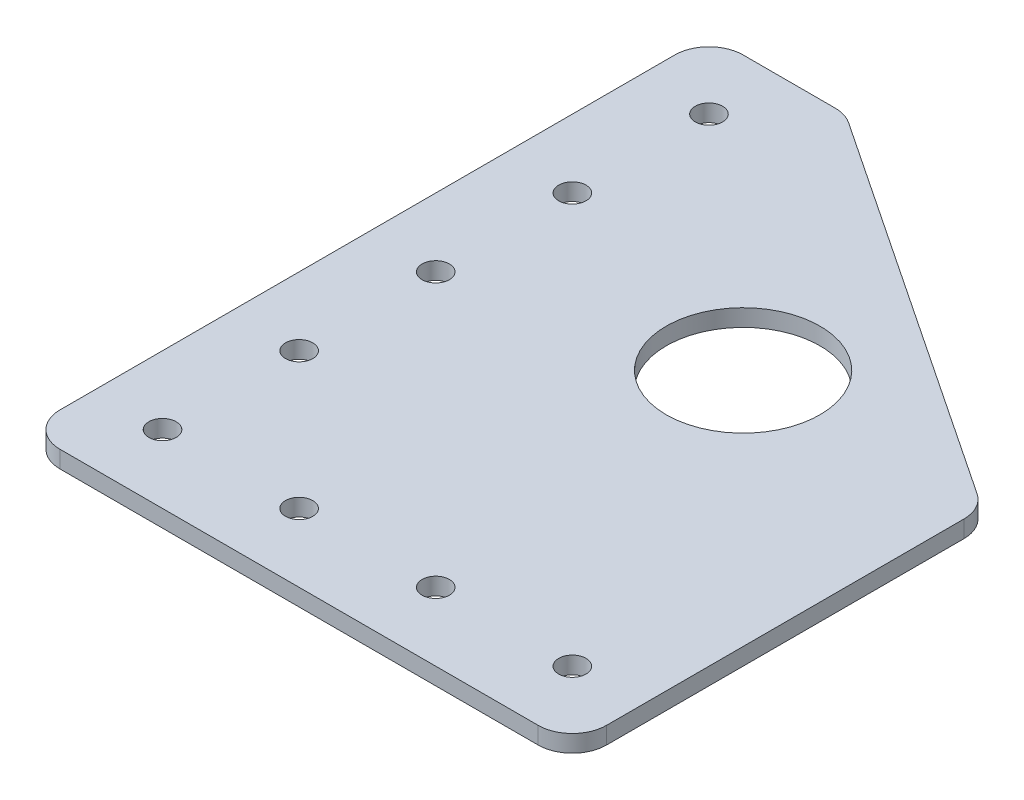
ISO-10303-21;
HEADER;
FILE_DESCRIPTION(('STEP AP214'),'2;1');
FILE_NAME('part.step','',(''),(''),'','','');
FILE_SCHEMA(('AUTOMOTIVE_DESIGN { 1 0 10303 214 1 1 1 1 }'));
ENDSEC;
DATA;
#1=APPLICATION_CONTEXT('core data for automotive mechanical design processes');
#2=APPLICATION_PROTOCOL_DEFINITION('international standard','automotive_design',2000,#1);
#3=PRODUCT_CONTEXT('',#1,'mechanical');
#4=PRODUCT('Part','Part','',(#3));
#5=PRODUCT_RELATED_PRODUCT_CATEGORY('part','',(#4));
#6=PRODUCT_DEFINITION_FORMATION('','',#4);
#7=PRODUCT_DEFINITION_CONTEXT('part definition',#1,'design');
#8=PRODUCT_DEFINITION('design','',#6,#7);
#9=PRODUCT_DEFINITION_SHAPE('','',#8);
#10=(LENGTH_UNIT() NAMED_UNIT(*) SI_UNIT(.MILLI.,.METRE.));
#11=(NAMED_UNIT(*) PLANE_ANGLE_UNIT() SI_UNIT($,.RADIAN.));
#12=(NAMED_UNIT(*) SI_UNIT($,.STERADIAN.) SOLID_ANGLE_UNIT());
#13=UNCERTAINTY_MEASURE_WITH_UNIT(LENGTH_MEASURE(1.E-05),#10,'distance_accuracy_value','');
#14=(GEOMETRIC_REPRESENTATION_CONTEXT(3) GLOBAL_UNCERTAINTY_ASSIGNED_CONTEXT((#13)) GLOBAL_UNIT_ASSIGNED_CONTEXT((#10,
#11,#12)) REPRESENTATION_CONTEXT('',''));
#15=CARTESIAN_POINT('',(0.,0.,0.));
#16=DIRECTION('',(0.,0.,1.));
#17=DIRECTION('',(1.,0.,0.));
#18=AXIS2_PLACEMENT_3D('',#15,#16,#17);
#19=CARTESIAN_POINT('',(95.25,3.175,-72.8015831336012));
#20=DIRECTION('',(0.,-1.,0.));
#21=DIRECTION('',(0.,0.,-1.));
#22=AXIS2_PLACEMENT_3D('',#19,#20,#21);
#23=PLANE('',#22);
#24=CARTESIAN_POINT('',(95.25,3.175,-72.8015831336012));
#25=DIRECTION('',(0.,1.,0.));
#26=DIRECTION('',(0.,0.,-1.));
#27=AXIS2_PLACEMENT_3D('',#24,#25,#26);
#28=CIRCLE('',#27,6.35);
#29=CARTESIAN_POINT('',(101.6,3.175,-72.8015831336012));
#30=VERTEX_POINT('',#29);
#31=CARTESIAN_POINT('',(98.7723462460302,3.175,-78.0851025026465));
#32=VERTEX_POINT('',#31);
#33=EDGE_CURVE('E182',#30,#32,#28,.T.);
#34=ORIENTED_EDGE('',*,*,#33,.T.);
#35=DIRECTION('',(-0.832050294337844,0.,-0.554700196225229));
#36=VECTOR('',#35,1.);
#37=CARTESIAN_POINT('',(26.9997209464321,3.175,-125.933519369045));
#38=LINE('',#37,#36);
#39=CARTESIAN_POINT('',(26.9997209464321,3.175,-125.933519369045));
#40=VERTEX_POINT('',#39);
#41=EDGE_CURVE('E106',#32,#40,#38,.T.);
#42=ORIENTED_EDGE('',*,*,#41,.T.);
#43=CARTESIAN_POINT('',(23.4773747004018,3.175,-120.65));
#44=DIRECTION('',(0.,1.,0.));
#45=DIRECTION('',(0.,0.,-1.));
#46=AXIS2_PLACEMENT_3D('',#43,#44,#45);
#47=CIRCLE('',#46,6.34999999999999);
#48=CARTESIAN_POINT('',(23.4773747004018,3.175,-127.));
#49=VERTEX_POINT('',#48);
#50=EDGE_CURVE('E211',#40,#49,#47,.T.);
#51=ORIENTED_EDGE('',*,*,#50,.T.);
#52=DIRECTION('',(-1.,0.,0.));
#53=VECTOR('',#52,1.);
#54=CARTESIAN_POINT('',(6.35000000000004,3.175,-127.));
#55=LINE('',#54,#53);
#56=CARTESIAN_POINT('',(6.35000000000004,3.175,-127.));
#57=VERTEX_POINT('',#56);
#58=EDGE_CURVE('E231',#49,#57,#55,.T.);
#59=ORIENTED_EDGE('',*,*,#58,.T.);
#60=CARTESIAN_POINT('',(6.35,3.175,-120.65));
#61=DIRECTION('',(0.,1.,0.));
#62=DIRECTION('',(0.,0.,-1.));
#63=AXIS2_PLACEMENT_3D('',#60,#61,#62);
#64=CIRCLE('',#63,6.35);
#65=CARTESIAN_POINT('',(0.,3.175,-120.65));
#66=VERTEX_POINT('',#65);
#67=EDGE_CURVE('E227',#57,#66,#64,.T.);
#68=ORIENTED_EDGE('',*,*,#67,.T.);
#69=DIRECTION('',(0.,0.,1.));
#70=VECTOR('',#69,1.);
#71=CARTESIAN_POINT('',(0.,3.175,-6.35000000000004));
#72=LINE('',#71,#70);
#73=CARTESIAN_POINT('',(0.,3.175,-6.35000000000004));
#74=VERTEX_POINT('',#73);
#75=EDGE_CURVE('E230',#66,#74,#72,.T.);
#76=ORIENTED_EDGE('',*,*,#75,.T.);
#77=CARTESIAN_POINT('',(6.35,3.175,-6.35));
#78=DIRECTION('',(0.,1.,0.));
#79=DIRECTION('',(0.,0.,1.));
#80=AXIS2_PLACEMENT_3D('',#77,#78,#79);
#81=CIRCLE('',#80,6.35);
#82=CARTESIAN_POINT('',(6.35,3.175,0.));
#83=VERTEX_POINT('',#82);
#84=EDGE_CURVE('E131',#74,#83,#81,.T.);
#85=ORIENTED_EDGE('',*,*,#84,.T.);
#86=DIRECTION('',(1.,0.,0.));
#87=VECTOR('',#86,1.);
#88=CARTESIAN_POINT('',(95.2499999999999,3.175,0.));
#89=LINE('',#88,#87);
#90=CARTESIAN_POINT('',(95.2499999999999,3.175,0.));
#91=VERTEX_POINT('',#90);
#92=EDGE_CURVE('E125',#83,#91,#89,.T.);
#93=ORIENTED_EDGE('',*,*,#92,.T.);
#94=CARTESIAN_POINT('',(95.25,3.175,-6.34999999999999));
#95=DIRECTION('',(0.,1.,0.));
#96=DIRECTION('',(0.,0.,-1.));
#97=AXIS2_PLACEMENT_3D('',#94,#95,#96);
#98=CIRCLE('',#97,6.35);
#99=CARTESIAN_POINT('',(101.6,3.175,-6.35000000000004));
#100=VERTEX_POINT('',#99);
#101=EDGE_CURVE('E129',#91,#100,#98,.T.);
#102=ORIENTED_EDGE('',*,*,#101,.T.);
#103=DIRECTION('',(0.,0.,-1.));
#104=VECTOR('',#103,1.);
#105=CARTESIAN_POINT('',(101.6,3.175,-72.8015831336012));
#106=LINE('',#105,#104);
#107=EDGE_CURVE('E57',#100,#30,#106,.T.);
#108=ORIENTED_EDGE('',*,*,#107,.T.);
#109=EDGE_LOOP('',(#34,#42,#51,#59,#68,#76,#85,#93,#102,#108));
#110=FACE_BOUND('',#109,.T.);
#111=CARTESIAN_POINT('',(88.9,3.175,-12.7));
#112=DIRECTION('',(0.,1.,0.));
#113=DIRECTION('',(0.,0.,1.));
#114=AXIS2_PLACEMENT_3D('',#111,#112,#113);
#115=CIRCLE('',#114,2.54);
#116=CARTESIAN_POINT('',(88.9,3.175,-10.16));
#117=VERTEX_POINT('',#116);
#118=EDGE_CURVE('E158',#117,#117,#115,.T.);
#119=ORIENTED_EDGE('',*,*,#118,.F.);
#120=EDGE_LOOP('',(#119));
#121=FACE_BOUND('',#120,.T.);
#122=CARTESIAN_POINT('',(63.5,3.175,-12.6999999999998));
#123=DIRECTION('',(0.,1.,0.));
#124=DIRECTION('',(0.,0.,1.));
#125=AXIS2_PLACEMENT_3D('',#122,#123,#124);
#126=CIRCLE('',#125,2.54000000000001);
#127=CARTESIAN_POINT('',(63.5,3.175,-10.1599999999998));
#128=VERTEX_POINT('',#127);
#129=EDGE_CURVE('E249',#128,#128,#126,.T.);
#130=ORIENTED_EDGE('',*,*,#129,.F.);
#131=EDGE_LOOP('',(#130));
#132=FACE_BOUND('',#131,.T.);
#133=CARTESIAN_POINT('',(38.1,3.175,-12.6999999999996));
#134=DIRECTION('',(0.,1.,0.));
#135=DIRECTION('',(0.,0.,1.));
#136=AXIS2_PLACEMENT_3D('',#133,#134,#135);
#137=CIRCLE('',#136,2.54);
#138=CARTESIAN_POINT('',(38.1,3.175,-10.1599999999996));
#139=VERTEX_POINT('',#138);
#140=EDGE_CURVE('E257',#139,#139,#137,.T.);
#141=ORIENTED_EDGE('',*,*,#140,.F.);
#142=EDGE_LOOP('',(#141));
#143=FACE_BOUND('',#142,.T.);
#144=CARTESIAN_POINT('',(12.7,3.175,-12.6999999999995));
#145=DIRECTION('',(0.,1.,0.));
#146=DIRECTION('',(0.,0.,1.));
#147=AXIS2_PLACEMENT_3D('',#144,#145,#146);
#148=CIRCLE('',#147,2.54);
#149=CARTESIAN_POINT('',(12.7,3.175,-10.1599999999995));
#150=VERTEX_POINT('',#149);
#151=EDGE_CURVE('E265',#150,#150,#148,.T.);
#152=ORIENTED_EDGE('',*,*,#151,.F.);
#153=EDGE_LOOP('',(#152));
#154=FACE_BOUND('',#153,.T.);
#155=CARTESIAN_POINT('',(12.6999999999999,3.175,-38.0999999999995));
#156=DIRECTION('',(0.,1.,0.));
#157=DIRECTION('',(0.,0.,1.));
#158=AXIS2_PLACEMENT_3D('',#155,#156,#157);
#159=CIRCLE('',#158,2.53999999999999);
#160=CARTESIAN_POINT('',(12.6999999999999,3.175,-35.5599999999995));
#161=VERTEX_POINT('',#160);
#162=EDGE_CURVE('E273',#161,#161,#159,.T.);
#163=ORIENTED_EDGE('',*,*,#162,.F.);
#164=EDGE_LOOP('',(#163));
#165=FACE_BOUND('',#164,.T.);
#166=CARTESIAN_POINT('',(12.6999999999998,3.175,-63.4999999999995));
#167=DIRECTION('',(0.,1.,0.));
#168=DIRECTION('',(0.,0.,1.));
#169=AXIS2_PLACEMENT_3D('',#166,#167,#168);
#170=CIRCLE('',#169,2.54);
#171=CARTESIAN_POINT('',(12.6999999999998,3.175,-60.9599999999995));
#172=VERTEX_POINT('',#171);
#173=EDGE_CURVE('E281',#172,#172,#170,.T.);
#174=ORIENTED_EDGE('',*,*,#173,.F.);
#175=EDGE_LOOP('',(#174));
#176=FACE_BOUND('',#175,.T.);
#177=CARTESIAN_POINT('',(12.6999999999997,3.175,-88.8999999999995));
#178=DIRECTION('',(0.,1.,0.));
#179=DIRECTION('',(0.,0.,1.));
#180=AXIS2_PLACEMENT_3D('',#177,#178,#179);
#181=CIRCLE('',#180,2.54);
#182=CARTESIAN_POINT('',(12.6999999999997,3.175,-86.3599999999994));
#183=VERTEX_POINT('',#182);
#184=EDGE_CURVE('E289',#183,#183,#181,.T.);
#185=ORIENTED_EDGE('',*,*,#184,.F.);
#186=EDGE_LOOP('',(#185));
#187=FACE_BOUND('',#186,.T.);
#188=CARTESIAN_POINT('',(12.6999999999996,3.175,-114.299999999999));
#189=DIRECTION('',(0.,1.,0.));
#190=DIRECTION('',(0.,0.,1.));
#191=AXIS2_PLACEMENT_3D('',#188,#189,#190);
#192=CIRCLE('',#191,2.54);
#193=CARTESIAN_POINT('',(12.6999999999996,3.175,-111.759999999999));
#194=VERTEX_POINT('',#193);
#195=EDGE_CURVE('E297',#194,#194,#192,.T.);
#196=ORIENTED_EDGE('',*,*,#195,.F.);
#197=EDGE_LOOP('',(#196));
#198=FACE_BOUND('',#197,.T.);
#199=CARTESIAN_POINT('',(57.15,3.175,-76.2));
#200=DIRECTION('',(0.,1.,0.));
#201=DIRECTION('',(0.,0.,1.));
#202=AXIS2_PLACEMENT_3D('',#199,#200,#201);
#203=CIRCLE('',#202,14.2875);
#204=CARTESIAN_POINT('',(57.15,3.175,-61.9125));
#205=VERTEX_POINT('',#204);
#206=EDGE_CURVE('E305',#205,#205,#203,.T.);
#207=ORIENTED_EDGE('',*,*,#206,.F.);
#208=EDGE_LOOP('',(#207));
#209=FACE_BOUND('',#208,.T.);
#210=ADVANCED_FACE('F39',(#110,#121,#132,#143,#154,#165,#176,#187,#198,#209),#23,.F.);
#211=CARTESIAN_POINT('',(95.25,0.,-72.8015831336012));
#212=DIRECTION('',(0.,-1.,0.));
#213=DIRECTION('',(0.,0.,-1.));
#214=AXIS2_PLACEMENT_3D('',#211,#212,#213);
#215=PLANE('',#214);
#216=CARTESIAN_POINT('',(12.6999999999996,0.,-114.299999999999));
#217=DIRECTION('',(0.,1.,0.));
#218=DIRECTION('',(0.,0.,1.));
#219=AXIS2_PLACEMENT_3D('',#216,#217,#218);
#220=CIRCLE('',#219,2.54);
#221=CARTESIAN_POINT('',(12.6999999999996,0.,-111.759999999999));
#222=VERTEX_POINT('',#221);
#223=EDGE_CURVE('E301',#222,#222,#220,.T.);
#224=ORIENTED_EDGE('',*,*,#223,.T.);
#225=EDGE_LOOP('',(#224));
#226=FACE_BOUND('',#225,.T.);
#227=CARTESIAN_POINT('',(12.6999999999998,0.,-63.4999999999995));
#228=DIRECTION('',(0.,1.,0.));
#229=DIRECTION('',(0.,0.,1.));
#230=AXIS2_PLACEMENT_3D('',#227,#228,#229);
#231=CIRCLE('',#230,2.54);
#232=CARTESIAN_POINT('',(12.6999999999998,0.,-60.9599999999995));
#233=VERTEX_POINT('',#232);
#234=EDGE_CURVE('E285',#233,#233,#231,.T.);
#235=ORIENTED_EDGE('',*,*,#234,.T.);
#236=EDGE_LOOP('',(#235));
#237=FACE_BOUND('',#236,.T.);
#238=CARTESIAN_POINT('',(12.7,0.,-12.6999999999995));
#239=DIRECTION('',(0.,1.,0.));
#240=DIRECTION('',(0.,0.,1.));
#241=AXIS2_PLACEMENT_3D('',#238,#239,#240);
#242=CIRCLE('',#241,2.54);
#243=CARTESIAN_POINT('',(12.7,0.,-10.1599999999995));
#244=VERTEX_POINT('',#243);
#245=EDGE_CURVE('E269',#244,#244,#242,.T.);
#246=ORIENTED_EDGE('',*,*,#245,.T.);
#247=EDGE_LOOP('',(#246));
#248=FACE_BOUND('',#247,.T.);
#249=CARTESIAN_POINT('',(63.5,0.,-12.6999999999998));
#250=DIRECTION('',(0.,1.,0.));
#251=DIRECTION('',(0.,0.,1.));
#252=AXIS2_PLACEMENT_3D('',#249,#250,#251);
#253=CIRCLE('',#252,2.54000000000001);
#254=CARTESIAN_POINT('',(63.5,0.,-10.1599999999998));
#255=VERTEX_POINT('',#254);
#256=EDGE_CURVE('E253',#255,#255,#253,.T.);
#257=ORIENTED_EDGE('',*,*,#256,.T.);
#258=EDGE_LOOP('',(#257));
#259=FACE_BOUND('',#258,.T.);
#260=CARTESIAN_POINT('',(95.25,0.,-72.8015831336012));
#261=DIRECTION('',(0.,1.,0.));
#262=DIRECTION('',(0.,0.,-1.));
#263=AXIS2_PLACEMENT_3D('',#260,#261,#262);
#264=CIRCLE('',#263,6.35);
#265=CARTESIAN_POINT('',(101.6,0.,-72.8015831336012));
#266=VERTEX_POINT('',#265);
#267=CARTESIAN_POINT('',(98.7723462460302,0.,-78.0851025026465));
#268=VERTEX_POINT('',#267);
#269=EDGE_CURVE('E153',#266,#268,#264,.T.);
#270=ORIENTED_EDGE('',*,*,#269,.F.);
#271=DIRECTION('',(0.,0.,-1.));
#272=VECTOR('',#271,1.);
#273=CARTESIAN_POINT('',(101.6,0.,-72.8015831336012));
#274=LINE('',#273,#272);
#275=CARTESIAN_POINT('',(101.6,0.,-6.35000000000004));
#276=VERTEX_POINT('',#275);
#277=EDGE_CURVE('E98',#276,#266,#274,.T.);
#278=ORIENTED_EDGE('',*,*,#277,.F.);
#279=CARTESIAN_POINT('',(95.25,0.,-6.34999999999999));
#280=DIRECTION('',(0.,1.,0.));
#281=DIRECTION('',(0.,0.,-1.));
#282=AXIS2_PLACEMENT_3D('',#279,#280,#281);
#283=CIRCLE('',#282,6.35);
#284=CARTESIAN_POINT('',(95.2499999999999,0.,0.));
#285=VERTEX_POINT('',#284);
#286=EDGE_CURVE('E92',#285,#276,#283,.T.);
#287=ORIENTED_EDGE('',*,*,#286,.F.);
#288=DIRECTION('',(1.,0.,0.));
#289=VECTOR('',#288,1.);
#290=CARTESIAN_POINT('',(95.2499999999999,0.,0.));
#291=LINE('',#290,#289);
#292=CARTESIAN_POINT('',(6.35,0.,0.));
#293=VERTEX_POINT('',#292);
#294=EDGE_CURVE('E140',#293,#285,#291,.T.);
#295=ORIENTED_EDGE('',*,*,#294,.F.);
#296=CARTESIAN_POINT('',(6.35,0.,-6.35));
#297=DIRECTION('',(0.,1.,0.));
#298=DIRECTION('',(0.,0.,1.));
#299=AXIS2_PLACEMENT_3D('',#296,#297,#298);
#300=CIRCLE('',#299,6.35);
#301=CARTESIAN_POINT('',(0.,0.,-6.35000000000004));
#302=VERTEX_POINT('',#301);
#303=EDGE_CURVE('E173',#302,#293,#300,.T.);
#304=ORIENTED_EDGE('',*,*,#303,.F.);
#305=DIRECTION('',(0.,0.,1.));
#306=VECTOR('',#305,1.);
#307=CARTESIAN_POINT('',(0.,0.,-6.35000000000004));
#308=LINE('',#307,#306);
#309=CARTESIAN_POINT('',(0.,0.,-120.65));
#310=VERTEX_POINT('',#309);
#311=EDGE_CURVE('E170',#310,#302,#308,.T.);
#312=ORIENTED_EDGE('',*,*,#311,.F.);
#313=CARTESIAN_POINT('',(6.35,0.,-120.65));
#314=DIRECTION('',(0.,1.,0.));
#315=DIRECTION('',(0.,0.,-1.));
#316=AXIS2_PLACEMENT_3D('',#313,#314,#315);
#317=CIRCLE('',#316,6.35);
#318=CARTESIAN_POINT('',(6.35000000000004,0.,-127.));
#319=VERTEX_POINT('',#318);
#320=EDGE_CURVE('E167',#319,#310,#317,.T.);
#321=ORIENTED_EDGE('',*,*,#320,.F.);
#322=DIRECTION('',(-1.,0.,0.));
#323=VECTOR('',#322,1.);
#324=CARTESIAN_POINT('',(6.35000000000004,0.,-127.));
#325=LINE('',#324,#323);
#326=CARTESIAN_POINT('',(23.4773747004018,0.,-127.));
#327=VERTEX_POINT('',#326);
#328=EDGE_CURVE('E164',#327,#319,#325,.T.);
#329=ORIENTED_EDGE('',*,*,#328,.F.);
#330=CARTESIAN_POINT('',(23.4773747004018,0.,-120.65));
#331=DIRECTION('',(0.,1.,0.));
#332=DIRECTION('',(0.,0.,-1.));
#333=AXIS2_PLACEMENT_3D('',#330,#331,#332);
#334=CIRCLE('',#333,6.34999999999999);
#335=CARTESIAN_POINT('',(26.9997209464321,0.,-125.933519369045));
#336=VERTEX_POINT('',#335);
#337=EDGE_CURVE('E161',#336,#327,#334,.T.);
#338=ORIENTED_EDGE('',*,*,#337,.F.);
#339=DIRECTION('',(-0.832050294337844,0.,-0.554700196225229));
#340=VECTOR('',#339,1.);
#341=CARTESIAN_POINT('',(26.9997209464321,0.,-125.933519369045));
#342=LINE('',#341,#340);
#343=EDGE_CURVE('E157',#268,#336,#342,.T.);
#344=ORIENTED_EDGE('',*,*,#343,.F.);
#345=EDGE_LOOP('',(#270,#278,#287,#295,#304,#312,#321,#329,#338,#344));
#346=FACE_BOUND('',#345,.T.);
#347=CARTESIAN_POINT('',(88.9,0.,-12.7));
#348=DIRECTION('',(0.,1.,0.));
#349=DIRECTION('',(0.,0.,1.));
#350=AXIS2_PLACEMENT_3D('',#347,#348,#349);
#351=CIRCLE('',#350,2.54);
#352=CARTESIAN_POINT('',(88.9,0.,-10.16));
#353=VERTEX_POINT('',#352);
#354=EDGE_CURVE('E245',#353,#353,#351,.T.);
#355=ORIENTED_EDGE('',*,*,#354,.T.);
#356=EDGE_LOOP('',(#355));
#357=FACE_BOUND('',#356,.T.);
#358=CARTESIAN_POINT('',(38.1,0.,-12.6999999999996));
#359=DIRECTION('',(0.,1.,0.));
#360=DIRECTION('',(0.,0.,1.));
#361=AXIS2_PLACEMENT_3D('',#358,#359,#360);
#362=CIRCLE('',#361,2.54);
#363=CARTESIAN_POINT('',(38.1,0.,-10.1599999999996));
#364=VERTEX_POINT('',#363);
#365=EDGE_CURVE('E261',#364,#364,#362,.T.);
#366=ORIENTED_EDGE('',*,*,#365,.T.);
#367=EDGE_LOOP('',(#366));
#368=FACE_BOUND('',#367,.T.);
#369=CARTESIAN_POINT('',(12.6999999999999,0.,-38.0999999999995));
#370=DIRECTION('',(0.,1.,0.));
#371=DIRECTION('',(0.,0.,1.));
#372=AXIS2_PLACEMENT_3D('',#369,#370,#371);
#373=CIRCLE('',#372,2.53999999999999);
#374=CARTESIAN_POINT('',(12.6999999999999,0.,-35.5599999999995));
#375=VERTEX_POINT('',#374);
#376=EDGE_CURVE('E277',#375,#375,#373,.T.);
#377=ORIENTED_EDGE('',*,*,#376,.T.);
#378=EDGE_LOOP('',(#377));
#379=FACE_BOUND('',#378,.T.);
#380=CARTESIAN_POINT('',(12.6999999999997,0.,-88.8999999999995));
#381=DIRECTION('',(0.,1.,0.));
#382=DIRECTION('',(0.,0.,1.));
#383=AXIS2_PLACEMENT_3D('',#380,#381,#382);
#384=CIRCLE('',#383,2.54);
#385=CARTESIAN_POINT('',(12.6999999999997,0.,-86.3599999999994));
#386=VERTEX_POINT('',#385);
#387=EDGE_CURVE('E293',#386,#386,#384,.T.);
#388=ORIENTED_EDGE('',*,*,#387,.T.);
#389=EDGE_LOOP('',(#388));
#390=FACE_BOUND('',#389,.T.);
#391=CARTESIAN_POINT('',(57.15,0.,-76.2));
#392=DIRECTION('',(0.,1.,0.));
#393=DIRECTION('',(0.,0.,1.));
#394=AXIS2_PLACEMENT_3D('',#391,#392,#393);
#395=CIRCLE('',#394,14.2875);
#396=CARTESIAN_POINT('',(57.15,0.,-61.9125));
#397=VERTEX_POINT('',#396);
#398=EDGE_CURVE('E309',#397,#397,#395,.T.);
#399=ORIENTED_EDGE('',*,*,#398,.T.);
#400=EDGE_LOOP('',(#399));
#401=FACE_BOUND('',#400,.T.);
#402=ADVANCED_FACE('F215',(#226,#237,#248,#259,#346,#357,#368,#379,#390,#401),#215,.T.);
#403=CARTESIAN_POINT('',(95.25,3.175,-72.8015831336012));
#404=DIRECTION('',(0.,-1.,0.));
#405=DIRECTION('',(0.,0.,-1.));
#406=AXIS2_PLACEMENT_3D('',#403,#404,#405);
#407=CYLINDRICAL_SURFACE('',#406,6.35);
#408=ORIENTED_EDGE('',*,*,#269,.T.);
#409=DIRECTION('',(0.,-1.,0.));
#410=VECTOR('',#409,1.);
#411=CARTESIAN_POINT('',(98.7723462460302,3.175,-78.0851025026465));
#412=LINE('',#411,#410);
#413=EDGE_CURVE('E11',#32,#268,#412,.T.);
#414=ORIENTED_EDGE('',*,*,#413,.F.);
#415=ORIENTED_EDGE('',*,*,#33,.F.);
#416=DIRECTION('',(0.,-1.,0.));
#417=VECTOR('',#416,1.);
#418=CARTESIAN_POINT('',(101.6,3.175,-72.8015831336012));
#419=LINE('',#418,#417);
#420=EDGE_CURVE('E149',#30,#266,#419,.T.);
#421=ORIENTED_EDGE('',*,*,#420,.T.);
#422=EDGE_LOOP('',(#408,#414,#415,#421));
#423=FACE_BOUND('',#422,.T.);
#424=ADVANCED_FACE('F41',(#423),#407,.T.);
#425=CARTESIAN_POINT('',(26.9997209464321,3.175,-125.933519369045));
#426=DIRECTION('',(-0.554700196225229,0.,0.832050294337844));
#427=DIRECTION('',(0.832050294337844,0.,0.554700196225229));
#428=AXIS2_PLACEMENT_3D('',#425,#426,#427);
#429=PLANE('',#428);
#430=ORIENTED_EDGE('',*,*,#343,.T.);
#431=DIRECTION('',(0.,-1.,0.));
#432=VECTOR('',#431,1.);
#433=CARTESIAN_POINT('',(26.9997209464321,3.175,-125.933519369045));
#434=LINE('',#433,#432);
#435=EDGE_CURVE('E49',#40,#336,#434,.T.);
#436=ORIENTED_EDGE('',*,*,#435,.F.);
#437=ORIENTED_EDGE('',*,*,#41,.F.);
#438=ORIENTED_EDGE('',*,*,#413,.T.);
#439=EDGE_LOOP('',(#430,#436,#437,#438));
#440=FACE_BOUND('',#439,.T.);
#441=ADVANCED_FACE('F351',(#440),#429,.F.);
#442=CARTESIAN_POINT('',(23.4773747004018,3.175,-120.65));
#443=DIRECTION('',(0.,-1.,0.));
#444=DIRECTION('',(0.,0.,-1.));
#445=AXIS2_PLACEMENT_3D('',#442,#443,#444);
#446=CYLINDRICAL_SURFACE('',#445,6.34999999999999);
#447=ORIENTED_EDGE('',*,*,#337,.T.);
#448=DIRECTION('',(0.,-1.,0.));
#449=VECTOR('',#448,1.);
#450=CARTESIAN_POINT('',(23.4773747004018,3.175,-127.));
#451=LINE('',#450,#449);
#452=EDGE_CURVE('E201',#49,#327,#451,.T.);
#453=ORIENTED_EDGE('',*,*,#452,.F.);
#454=ORIENTED_EDGE('',*,*,#50,.F.);
#455=ORIENTED_EDGE('',*,*,#435,.T.);
#456=EDGE_LOOP('',(#447,#453,#454,#455));
#457=FACE_BOUND('',#456,.T.);
#458=ADVANCED_FACE('F209',(#457),#446,.T.);
#459=CARTESIAN_POINT('',(6.35000000000004,3.175,-127.));
#460=DIRECTION('',(0.,0.,1.));
#461=DIRECTION('',(1.,0.,0.));
#462=AXIS2_PLACEMENT_3D('',#459,#460,#461);
#463=PLANE('',#462);
#464=ORIENTED_EDGE('',*,*,#328,.T.);
#465=DIRECTION('',(0.,-1.,0.));
#466=VECTOR('',#465,1.);
#467=CARTESIAN_POINT('',(6.35000000000004,3.175,-127.));
#468=LINE('',#467,#466);
#469=EDGE_CURVE('E197',#57,#319,#468,.T.);
#470=ORIENTED_EDGE('',*,*,#469,.F.);
#471=ORIENTED_EDGE('',*,*,#58,.F.);
#472=ORIENTED_EDGE('',*,*,#452,.T.);
#473=EDGE_LOOP('',(#464,#470,#471,#472));
#474=FACE_BOUND('',#473,.T.);
#475=ADVANCED_FACE('F221',(#474),#463,.F.);
#476=CARTESIAN_POINT('',(6.35,3.175,-120.65));
#477=DIRECTION('',(0.,-1.,0.));
#478=DIRECTION('',(0.,0.,-1.));
#479=AXIS2_PLACEMENT_3D('',#476,#477,#478);
#480=CYLINDRICAL_SURFACE('',#479,6.35);
#481=ORIENTED_EDGE('',*,*,#320,.T.);
#482=DIRECTION('',(0.,-1.,0.));
#483=VECTOR('',#482,1.);
#484=CARTESIAN_POINT('',(0.,3.175,-120.65));
#485=LINE('',#484,#483);
#486=EDGE_CURVE('E193',#66,#310,#485,.T.);
#487=ORIENTED_EDGE('',*,*,#486,.F.);
#488=ORIENTED_EDGE('',*,*,#67,.F.);
#489=ORIENTED_EDGE('',*,*,#469,.T.);
#490=EDGE_LOOP('',(#481,#487,#488,#489));
#491=FACE_BOUND('',#490,.T.);
#492=ADVANCED_FACE('F225',(#491),#480,.T.);
#493=CARTESIAN_POINT('',(0.,3.175,-6.35000000000004));
#494=DIRECTION('',(1.,0.,0.));
#495=DIRECTION('',(0.,0.,-1.));
#496=AXIS2_PLACEMENT_3D('',#493,#494,#495);
#497=PLANE('',#496);
#498=ORIENTED_EDGE('',*,*,#311,.T.);
#499=DIRECTION('',(0.,-1.,0.));
#500=VECTOR('',#499,1.);
#501=CARTESIAN_POINT('',(0.,3.175,-6.35000000000004));
#502=LINE('',#501,#500);
#503=EDGE_CURVE('E189',#74,#302,#502,.T.);
#504=ORIENTED_EDGE('',*,*,#503,.F.);
#505=ORIENTED_EDGE('',*,*,#75,.F.);
#506=ORIENTED_EDGE('',*,*,#486,.T.);
#507=EDGE_LOOP('',(#498,#504,#505,#506));
#508=FACE_BOUND('',#507,.T.);
#509=ADVANCED_FACE('F341',(#508),#497,.F.);
#510=CARTESIAN_POINT('',(6.35,3.175,-6.35));
#511=DIRECTION('',(0.,-1.,0.));
#512=DIRECTION('',(0.,0.,-1.));
#513=AXIS2_PLACEMENT_3D('',#510,#511,#512);
#514=CYLINDRICAL_SURFACE('',#513,6.35);
#515=ORIENTED_EDGE('',*,*,#303,.T.);
#516=DIRECTION('',(0.,-1.,0.));
#517=VECTOR('',#516,1.);
#518=CARTESIAN_POINT('',(6.35,3.175,0.));
#519=LINE('',#518,#517);
#520=EDGE_CURVE('E142',#83,#293,#519,.T.);
#521=ORIENTED_EDGE('',*,*,#520,.F.);
#522=ORIENTED_EDGE('',*,*,#84,.F.);
#523=ORIENTED_EDGE('',*,*,#503,.T.);
#524=EDGE_LOOP('',(#515,#521,#522,#523));
#525=FACE_BOUND('',#524,.T.);
#526=ADVANCED_FACE('F338',(#525),#514,.T.);
#527=CARTESIAN_POINT('',(95.2499999999999,3.175,0.));
#528=DIRECTION('',(0.,0.,-1.));
#529=DIRECTION('',(-1.,0.,0.));
#530=AXIS2_PLACEMENT_3D('',#527,#528,#529);
#531=PLANE('',#530);
#532=ORIENTED_EDGE('',*,*,#294,.T.);
#533=DIRECTION('',(0.,-1.,0.));
#534=VECTOR('',#533,1.);
#535=CARTESIAN_POINT('',(95.2499999999999,3.175,0.));
#536=LINE('',#535,#534);
#537=EDGE_CURVE('E137',#91,#285,#536,.T.);
#538=ORIENTED_EDGE('',*,*,#537,.F.);
#539=ORIENTED_EDGE('',*,*,#92,.F.);
#540=ORIENTED_EDGE('',*,*,#520,.T.);
#541=EDGE_LOOP('',(#532,#538,#539,#540));
#542=FACE_BOUND('',#541,.T.);
#543=ADVANCED_FACE('F138',(#542),#531,.F.);
#544=CARTESIAN_POINT('',(95.25,3.175,-6.34999999999999));
#545=DIRECTION('',(0.,-1.,0.));
#546=DIRECTION('',(0.,0.,-1.));
#547=AXIS2_PLACEMENT_3D('',#544,#545,#546);
#548=CYLINDRICAL_SURFACE('',#547,6.35);
#549=ORIENTED_EDGE('',*,*,#286,.T.);
#550=DIRECTION('',(0.,-1.,0.));
#551=VECTOR('',#550,1.);
#552=CARTESIAN_POINT('',(101.6,3.175,-6.35000000000004));
#553=LINE('',#552,#551);
#554=EDGE_CURVE('E143',#100,#276,#553,.T.);
#555=ORIENTED_EDGE('',*,*,#554,.F.);
#556=ORIENTED_EDGE('',*,*,#101,.F.);
#557=ORIENTED_EDGE('',*,*,#537,.T.);
#558=EDGE_LOOP('',(#549,#555,#556,#557));
#559=FACE_BOUND('',#558,.T.);
#560=ADVANCED_FACE('F145',(#559),#548,.T.);
#561=CARTESIAN_POINT('',(101.6,3.175,-72.8015831336012));
#562=DIRECTION('',(-1.,0.,0.));
#563=DIRECTION('',(0.,0.,1.));
#564=AXIS2_PLACEMENT_3D('',#561,#562,#563);
#565=PLANE('',#564);
#566=ORIENTED_EDGE('',*,*,#277,.T.);
#567=ORIENTED_EDGE('',*,*,#420,.F.);
#568=ORIENTED_EDGE('',*,*,#107,.F.);
#569=ORIENTED_EDGE('',*,*,#554,.T.);
#570=EDGE_LOOP('',(#566,#567,#568,#569));
#571=FACE_BOUND('',#570,.T.);
#572=ADVANCED_FACE('F331',(#571),#565,.F.);
#573=CARTESIAN_POINT('',(88.9,3.175,-12.7));
#574=DIRECTION('',(0.,-1.,0.));
#575=DIRECTION('',(0.,0.,-1.));
#576=AXIS2_PLACEMENT_3D('',#573,#574,#575);
#577=CYLINDRICAL_SURFACE('',#576,2.54);
#578=ORIENTED_EDGE('',*,*,#118,.T.);
#579=EDGE_LOOP('',(#578));
#580=FACE_BOUND('',#579,.T.);
#581=ORIENTED_EDGE('',*,*,#354,.F.);
#582=EDGE_LOOP('',(#581));
#583=FACE_BOUND('',#582,.T.);
#584=ADVANCED_FACE('F328',(#580,#583),#577,.F.);
#585=CARTESIAN_POINT('',(63.5,3.175,-12.6999999999998));
#586=DIRECTION('',(0.,-1.,0.));
#587=DIRECTION('',(0.,0.,-1.));
#588=AXIS2_PLACEMENT_3D('',#585,#586,#587);
#589=CYLINDRICAL_SURFACE('',#588,2.54000000000001);
#590=ORIENTED_EDGE('',*,*,#129,.T.);
#591=EDGE_LOOP('',(#590));
#592=FACE_BOUND('',#591,.T.);
#593=ORIENTED_EDGE('',*,*,#256,.F.);
#594=EDGE_LOOP('',(#593));
#595=FACE_BOUND('',#594,.T.);
#596=ADVANCED_FACE('F427',(#592,#595),#589,.F.);
#597=CARTESIAN_POINT('',(38.1,3.175,-12.6999999999996));
#598=DIRECTION('',(0.,-1.,0.));
#599=DIRECTION('',(0.,0.,-1.));
#600=AXIS2_PLACEMENT_3D('',#597,#598,#599);
#601=CYLINDRICAL_SURFACE('',#600,2.54);
#602=ORIENTED_EDGE('',*,*,#140,.T.);
#603=EDGE_LOOP('',(#602));
#604=FACE_BOUND('',#603,.T.);
#605=ORIENTED_EDGE('',*,*,#365,.F.);
#606=EDGE_LOOP('',(#605));
#607=FACE_BOUND('',#606,.T.);
#608=ADVANCED_FACE('F435',(#604,#607),#601,.F.);
#609=CARTESIAN_POINT('',(12.7,3.175,-12.6999999999995));
#610=DIRECTION('',(0.,-1.,0.));
#611=DIRECTION('',(0.,0.,-1.));
#612=AXIS2_PLACEMENT_3D('',#609,#610,#611);
#613=CYLINDRICAL_SURFACE('',#612,2.54);
#614=ORIENTED_EDGE('',*,*,#151,.T.);
#615=EDGE_LOOP('',(#614));
#616=FACE_BOUND('',#615,.T.);
#617=ORIENTED_EDGE('',*,*,#245,.F.);
#618=EDGE_LOOP('',(#617));
#619=FACE_BOUND('',#618,.T.);
#620=ADVANCED_FACE('F443',(#616,#619),#613,.F.);
#621=CARTESIAN_POINT('',(12.6999999999999,3.175,-38.0999999999995));
#622=DIRECTION('',(0.,-1.,0.));
#623=DIRECTION('',(0.,0.,-1.));
#624=AXIS2_PLACEMENT_3D('',#621,#622,#623);
#625=CYLINDRICAL_SURFACE('',#624,2.53999999999999);
#626=ORIENTED_EDGE('',*,*,#162,.T.);
#627=EDGE_LOOP('',(#626));
#628=FACE_BOUND('',#627,.T.);
#629=ORIENTED_EDGE('',*,*,#376,.F.);
#630=EDGE_LOOP('',(#629));
#631=FACE_BOUND('',#630,.T.);
#632=ADVANCED_FACE('F452',(#628,#631),#625,.F.);
#633=CARTESIAN_POINT('',(12.6999999999998,3.175,-63.4999999999995));
#634=DIRECTION('',(0.,-1.,0.));
#635=DIRECTION('',(0.,0.,-1.));
#636=AXIS2_PLACEMENT_3D('',#633,#634,#635);
#637=CYLINDRICAL_SURFACE('',#636,2.54);
#638=ORIENTED_EDGE('',*,*,#173,.T.);
#639=EDGE_LOOP('',(#638));
#640=FACE_BOUND('',#639,.T.);
#641=ORIENTED_EDGE('',*,*,#234,.F.);
#642=EDGE_LOOP('',(#641));
#643=FACE_BOUND('',#642,.T.);
#644=ADVANCED_FACE('F461',(#640,#643),#637,.F.);
#645=CARTESIAN_POINT('',(12.6999999999997,3.175,-88.8999999999995));
#646=DIRECTION('',(0.,-1.,0.));
#647=DIRECTION('',(0.,0.,-1.));
#648=AXIS2_PLACEMENT_3D('',#645,#646,#647);
#649=CYLINDRICAL_SURFACE('',#648,2.54);
#650=ORIENTED_EDGE('',*,*,#184,.T.);
#651=EDGE_LOOP('',(#650));
#652=FACE_BOUND('',#651,.T.);
#653=ORIENTED_EDGE('',*,*,#387,.F.);
#654=EDGE_LOOP('',(#653));
#655=FACE_BOUND('',#654,.T.);
#656=ADVANCED_FACE('F470',(#652,#655),#649,.F.);
#657=CARTESIAN_POINT('',(12.6999999999996,3.175,-114.299999999999));
#658=DIRECTION('',(0.,-1.,0.));
#659=DIRECTION('',(0.,0.,-1.));
#660=AXIS2_PLACEMENT_3D('',#657,#658,#659);
#661=CYLINDRICAL_SURFACE('',#660,2.54);
#662=ORIENTED_EDGE('',*,*,#195,.T.);
#663=EDGE_LOOP('',(#662));
#664=FACE_BOUND('',#663,.T.);
#665=ORIENTED_EDGE('',*,*,#223,.F.);
#666=EDGE_LOOP('',(#665));
#667=FACE_BOUND('',#666,.T.);
#668=ADVANCED_FACE('F479',(#664,#667),#661,.F.);
#669=CARTESIAN_POINT('',(57.15,3.175,-76.2));
#670=DIRECTION('',(0.,-1.,0.));
#671=DIRECTION('',(0.,0.,-1.));
#672=AXIS2_PLACEMENT_3D('',#669,#670,#671);
#673=CYLINDRICAL_SURFACE('',#672,14.2875);
#674=ORIENTED_EDGE('',*,*,#206,.T.);
#675=EDGE_LOOP('',(#674));
#676=FACE_BOUND('',#675,.T.);
#677=ORIENTED_EDGE('',*,*,#398,.F.);
#678=EDGE_LOOP('',(#677));
#679=FACE_BOUND('',#678,.T.);
#680=ADVANCED_FACE('F317',(#676,#679),#673,.F.);
#681=CLOSED_SHELL('',(#210,#402,#424,#441,#458,#475,#492,#509,#526,#543,#560,#572,#584,#596,
#608,#620,#632,#644,#656,#668,#680));
#682=MANIFOLD_SOLID_BREP('B2',#681);
#683=ADVANCED_BREP_SHAPE_REPRESENTATION('',(#18,#682),#14);
#684=SHAPE_DEFINITION_REPRESENTATION(#9,#683);
ENDSEC;
END-ISO-10303-21;
